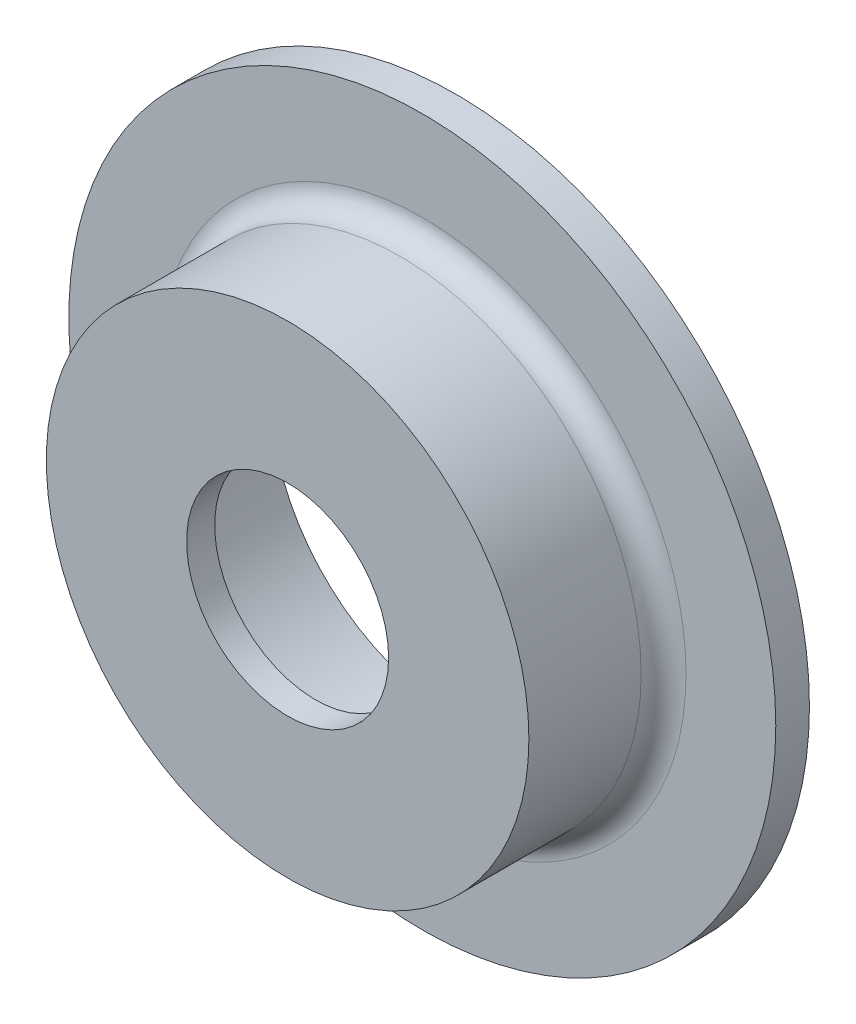
ISO-10303-21;
HEADER;
FILE_DESCRIPTION(('STEP AP214'),'2;1');
FILE_NAME('part.step','',(''),(''),'','','');
FILE_SCHEMA(('AUTOMOTIVE_DESIGN { 1 0 10303 214 1 1 1 1 }'));
ENDSEC;
DATA;
#1=APPLICATION_CONTEXT('core data for automotive mechanical design processes');
#2=APPLICATION_PROTOCOL_DEFINITION('international standard','automotive_design',2000,#1);
#3=PRODUCT_CONTEXT('',#1,'mechanical');
#4=PRODUCT('Part','Part','',(#3));
#5=PRODUCT_RELATED_PRODUCT_CATEGORY('part','',(#4));
#6=PRODUCT_DEFINITION_FORMATION('','',#4);
#7=PRODUCT_DEFINITION_CONTEXT('part definition',#1,'design');
#8=PRODUCT_DEFINITION('design','',#6,#7);
#9=PRODUCT_DEFINITION_SHAPE('','',#8);
#10=(LENGTH_UNIT() NAMED_UNIT(*) SI_UNIT(.MILLI.,.METRE.));
#11=(NAMED_UNIT(*) PLANE_ANGLE_UNIT() SI_UNIT($,.RADIAN.));
#12=(NAMED_UNIT(*) SI_UNIT($,.STERADIAN.) SOLID_ANGLE_UNIT());
#13=UNCERTAINTY_MEASURE_WITH_UNIT(LENGTH_MEASURE(1.E-05),#10,'distance_accuracy_value','');
#14=(GEOMETRIC_REPRESENTATION_CONTEXT(3) GLOBAL_UNCERTAINTY_ASSIGNED_CONTEXT((#13)) GLOBAL_UNIT_ASSIGNED_CONTEXT((#10,
#11,#12)) REPRESENTATION_CONTEXT('',''));
#15=CARTESIAN_POINT('',(0.,0.,0.));
#16=DIRECTION('',(0.,0.,1.));
#17=DIRECTION('',(1.,0.,0.));
#18=AXIS2_PLACEMENT_3D('',#15,#16,#17);
#19=CARTESIAN_POINT('',(0.,0.,0.));
#20=DIRECTION('',(0.,0.,1.));
#21=DIRECTION('',(1.,0.,0.));
#22=AXIS2_PLACEMENT_3D('',#19,#20,#21);
#23=PLANE('',#22);
#24=CARTESIAN_POINT('',(0.,0.,0.));
#25=DIRECTION('',(0.,0.,1.));
#26=DIRECTION('',(1.,0.,0.));
#27=AXIS2_PLACEMENT_3D('',#24,#25,#26);
#28=CIRCLE('',#27,12.6);
#29=CARTESIAN_POINT('',(12.6,0.,0.));
#30=VERTEX_POINT('',#29);
#31=EDGE_CURVE('E64',#30,#30,#28,.T.);
#32=ORIENTED_EDGE('',*,*,#31,.F.);
#33=EDGE_LOOP('',(#32));
#34=FACE_BOUND('',#33,.T.);
#35=CARTESIAN_POINT('',(0.,0.,0.));
#36=DIRECTION('',(0.,0.,1.));
#37=DIRECTION('',(1.,0.,0.));
#38=AXIS2_PLACEMENT_3D('',#35,#36,#37);
#39=CIRCLE('',#38,6.6);
#40=CARTESIAN_POINT('',(6.6,0.,0.));
#41=VERTEX_POINT('',#40);
#42=EDGE_CURVE('E55',#41,#41,#39,.T.);
#43=ORIENTED_EDGE('',*,*,#42,.T.);
#44=EDGE_LOOP('',(#43));
#45=FACE_BOUND('',#44,.T.);
#46=ADVANCED_FACE('F31',(#34,#45),#23,.F.);
#47=CARTESIAN_POINT('',(0.,0.,1.2));
#48=DIRECTION('',(0.,0.,1.));
#49=DIRECTION('',(1.,0.,0.));
#50=AXIS2_PLACEMENT_3D('',#47,#48,#49);
#51=PLANE('',#50);
#52=CARTESIAN_POINT('',(0.,0.,1.2));
#53=DIRECTION('',(0.,0.,1.));
#54=DIRECTION('',(1.,0.,0.));
#55=AXIS2_PLACEMENT_3D('',#52,#53,#54);
#56=CIRCLE('',#55,9.4);
#57=CARTESIAN_POINT('',(9.4,0.,1.2));
#58=VERTEX_POINT('',#57);
#59=EDGE_CURVE('E38',#58,#58,#56,.F.);
#60=ORIENTED_EDGE('',*,*,#59,.T.);
#61=EDGE_LOOP('',(#60));
#62=FACE_BOUND('',#61,.T.);
#63=CARTESIAN_POINT('',(0.,0.,1.2));
#64=DIRECTION('',(0.,0.,1.));
#65=DIRECTION('',(1.,0.,0.));
#66=AXIS2_PLACEMENT_3D('',#63,#64,#65);
#67=CIRCLE('',#66,12.6);
#68=CARTESIAN_POINT('',(12.6,0.,1.2));
#69=VERTEX_POINT('',#68);
#70=EDGE_CURVE('E58',#69,#69,#67,.T.);
#71=ORIENTED_EDGE('',*,*,#70,.T.);
#72=EDGE_LOOP('',(#71));
#73=FACE_BOUND('',#72,.T.);
#74=ADVANCED_FACE('F74',(#62,#73),#51,.T.);
#75=CARTESIAN_POINT('',(0.,0.,1.2));
#76=DIRECTION('',(0.,0.,-1.));
#77=DIRECTION('',(-1.,0.,0.));
#78=AXIS2_PLACEMENT_3D('',#75,#76,#77);
#79=CYLINDRICAL_SURFACE('',#78,12.6);
#80=ORIENTED_EDGE('',*,*,#70,.F.);
#81=EDGE_LOOP('',(#80));
#82=FACE_BOUND('',#81,.T.);
#83=ORIENTED_EDGE('',*,*,#31,.T.);
#84=EDGE_LOOP('',(#83));
#85=FACE_BOUND('',#84,.T.);
#86=ADVANCED_FACE('F70',(#82,#85),#79,.T.);
#87=CARTESIAN_POINT('',(0.,0.,6.));
#88=DIRECTION('',(0.,0.,-1.));
#89=DIRECTION('',(-1.,0.,0.));
#90=AXIS2_PLACEMENT_3D('',#87,#88,#89);
#91=CYLINDRICAL_SURFACE('',#90,8.6);
#92=CARTESIAN_POINT('',(0.,0.,2.));
#93=DIRECTION('',(0.,0.,1.));
#94=DIRECTION('',(1.,0.,0.));
#95=AXIS2_PLACEMENT_3D('',#92,#93,#94);
#96=CIRCLE('',#95,8.6);
#97=CARTESIAN_POINT('',(8.6,0.,2.));
#98=VERTEX_POINT('',#97);
#99=EDGE_CURVE('E10',#98,#98,#96,.T.);
#100=ORIENTED_EDGE('',*,*,#99,.T.);
#101=EDGE_LOOP('',(#100));
#102=FACE_BOUND('',#101,.T.);
#103=CARTESIAN_POINT('',(0.,0.,6.));
#104=DIRECTION('',(0.,0.,1.));
#105=DIRECTION('',(1.,0.,0.));
#106=AXIS2_PLACEMENT_3D('',#103,#104,#105);
#107=CIRCLE('',#106,8.6);
#108=CARTESIAN_POINT('',(8.6,0.,6.));
#109=VERTEX_POINT('',#108);
#110=EDGE_CURVE('E54',#109,#109,#107,.T.);
#111=ORIENTED_EDGE('',*,*,#110,.F.);
#112=EDGE_LOOP('',(#111));
#113=FACE_BOUND('',#112,.T.);
#114=ADVANCED_FACE('F111',(#102,#113),#91,.T.);
#115=CARTESIAN_POINT('',(0.,0.,6.));
#116=DIRECTION('',(0.,0.,-1.));
#117=DIRECTION('',(-1.,0.,0.));
#118=AXIS2_PLACEMENT_3D('',#115,#116,#117);
#119=CYLINDRICAL_SURFACE('',#118,3.6);
#120=CARTESIAN_POINT('',(0.,0.,5.));
#121=DIRECTION('',(0.,0.,1.));
#122=DIRECTION('',(1.,0.,0.));
#123=AXIS2_PLACEMENT_3D('',#120,#121,#122);
#124=CIRCLE('',#123,3.6);
#125=CARTESIAN_POINT('',(3.6,0.,5.));
#126=VERTEX_POINT('',#125);
#127=EDGE_CURVE('E51',#126,#126,#124,.T.);
#128=ORIENTED_EDGE('',*,*,#127,.F.);
#129=EDGE_LOOP('',(#128));
#130=FACE_BOUND('',#129,.T.);
#131=CARTESIAN_POINT('',(0.,0.,6.));
#132=DIRECTION('',(0.,0.,1.));
#133=DIRECTION('',(1.,0.,0.));
#134=AXIS2_PLACEMENT_3D('',#131,#132,#133);
#135=CIRCLE('',#134,3.6);
#136=CARTESIAN_POINT('',(3.6,0.,6.));
#137=VERTEX_POINT('',#136);
#138=EDGE_CURVE('E61',#137,#137,#135,.T.);
#139=ORIENTED_EDGE('',*,*,#138,.T.);
#140=EDGE_LOOP('',(#139));
#141=FACE_BOUND('',#140,.T.);
#142=ADVANCED_FACE('F91',(#130,#141),#119,.F.);
#143=CARTESIAN_POINT('',(0.,0.,6.));
#144=DIRECTION('',(0.,0.,1.));
#145=DIRECTION('',(1.,0.,0.));
#146=AXIS2_PLACEMENT_3D('',#143,#144,#145);
#147=PLANE('',#146);
#148=ORIENTED_EDGE('',*,*,#110,.T.);
#149=EDGE_LOOP('',(#148));
#150=FACE_BOUND('',#149,.T.);
#151=ORIENTED_EDGE('',*,*,#138,.F.);
#152=EDGE_LOOP('',(#151));
#153=FACE_BOUND('',#152,.T.);
#154=ADVANCED_FACE('F81',(#150,#153),#147,.T.);
#155=CARTESIAN_POINT('',(0.,0.,5.));
#156=DIRECTION('',(0.,0.,-1.));
#157=DIRECTION('',(-1.,0.,0.));
#158=AXIS2_PLACEMENT_3D('',#155,#156,#157);
#159=CYLINDRICAL_SURFACE('',#158,6.6);
#160=CARTESIAN_POINT('',(0.,0.,4.2));
#161=DIRECTION('',(0.,0.,1.));
#162=DIRECTION('',(1.,0.,0.));
#163=AXIS2_PLACEMENT_3D('',#160,#161,#162);
#164=CIRCLE('',#163,6.6);
#165=CARTESIAN_POINT('',(6.6,0.,4.2));
#166=VERTEX_POINT('',#165);
#167=EDGE_CURVE('E46',#166,#166,#164,.T.);
#168=ORIENTED_EDGE('',*,*,#167,.T.);
#169=EDGE_LOOP('',(#168));
#170=FACE_BOUND('',#169,.T.);
#171=ORIENTED_EDGE('',*,*,#42,.F.);
#172=EDGE_LOOP('',(#171));
#173=FACE_BOUND('',#172,.T.);
#174=ADVANCED_FACE('F78',(#170,#173),#159,.F.);
#175=CARTESIAN_POINT('',(0.,0.,5.));
#176=DIRECTION('',(0.,0.,1.));
#177=DIRECTION('',(1.,0.,0.));
#178=AXIS2_PLACEMENT_3D('',#175,#176,#177);
#179=PLANE('',#178);
#180=CARTESIAN_POINT('',(0.,0.,5.));
#181=DIRECTION('',(0.,0.,1.));
#182=DIRECTION('',(1.,0.,0.));
#183=AXIS2_PLACEMENT_3D('',#180,#181,#182);
#184=CIRCLE('',#183,5.8);
#185=CARTESIAN_POINT('',(5.8,0.,5.));
#186=VERTEX_POINT('',#185);
#187=EDGE_CURVE('E42',#186,#186,#184,.F.);
#188=ORIENTED_EDGE('',*,*,#187,.T.);
#189=EDGE_LOOP('',(#188));
#190=FACE_BOUND('',#189,.T.);
#191=ORIENTED_EDGE('',*,*,#127,.T.);
#192=EDGE_LOOP('',(#191));
#193=FACE_BOUND('',#192,.T.);
#194=ADVANCED_FACE('F80',(#190,#193),#179,.F.);
#195=CARTESIAN_POINT('',(0.,0.,4.2));
#196=DIRECTION('',(0.,0.,1.));
#197=DIRECTION('',(1.,0.,0.));
#198=AXIS2_PLACEMENT_3D('',#195,#196,#197);
#199=TOROIDAL_SURFACE('',#198,5.8,0.8);
#200=ORIENTED_EDGE('',*,*,#187,.F.);
#201=EDGE_LOOP('',(#200));
#202=FACE_BOUND('',#201,.T.);
#203=ORIENTED_EDGE('',*,*,#167,.F.);
#204=EDGE_LOOP('',(#203));
#205=FACE_BOUND('',#204,.T.);
#206=ADVANCED_FACE('F88',(#202,#205),#199,.F.);
#207=CARTESIAN_POINT('',(0.,0.,2.));
#208=DIRECTION('',(0.,0.,1.));
#209=DIRECTION('',(1.,0.,0.));
#210=AXIS2_PLACEMENT_3D('',#207,#208,#209);
#211=TOROIDAL_SURFACE('',#210,9.4,0.8);
#212=ORIENTED_EDGE('',*,*,#99,.F.);
#213=EDGE_LOOP('',(#212));
#214=FACE_BOUND('',#213,.T.);
#215=ORIENTED_EDGE('',*,*,#59,.F.);
#216=EDGE_LOOP('',(#215));
#217=FACE_BOUND('',#216,.T.);
#218=ADVANCED_FACE('F33',(#214,#217),#211,.F.);
#219=CLOSED_SHELL('',(#46,#74,#86,#114,#142,#154,#174,#194,#206,#218));
#220=MANIFOLD_SOLID_BREP('B2',#219);
#221=ADVANCED_BREP_SHAPE_REPRESENTATION('',(#18,#220),#14);
#222=SHAPE_DEFINITION_REPRESENTATION(#9,#221);
ENDSEC;
END-ISO-10303-21;
